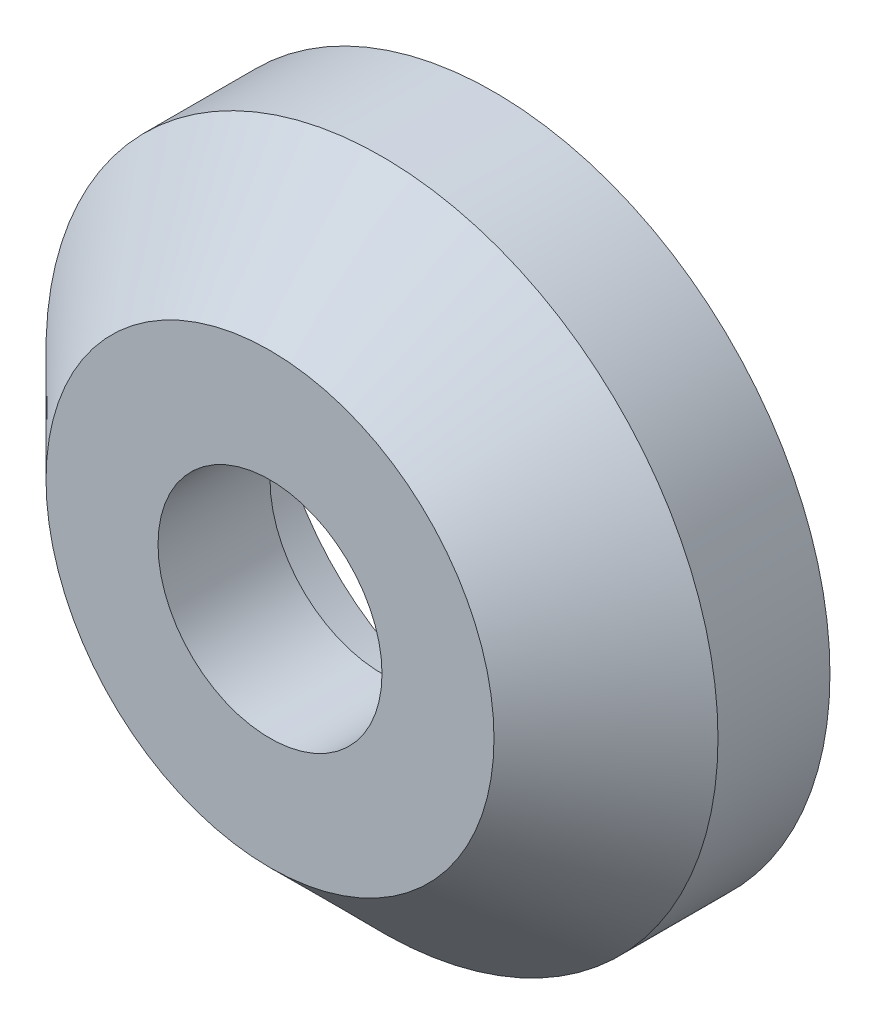
ISO-10303-21;
HEADER;
FILE_DESCRIPTION(('STEP AP214'),'2;1');
FILE_NAME('part.step','',(''),(''),'','','');
FILE_SCHEMA(('AUTOMOTIVE_DESIGN { 1 0 10303 214 1 1 1 1 }'));
ENDSEC;
DATA;
#1=APPLICATION_CONTEXT('core data for automotive mechanical design processes');
#2=APPLICATION_PROTOCOL_DEFINITION('international standard','automotive_design',2000,#1);
#3=PRODUCT_CONTEXT('',#1,'mechanical');
#4=PRODUCT('Part','Part','',(#3));
#5=PRODUCT_RELATED_PRODUCT_CATEGORY('part','',(#4));
#6=PRODUCT_DEFINITION_FORMATION('','',#4);
#7=PRODUCT_DEFINITION_CONTEXT('part definition',#1,'design');
#8=PRODUCT_DEFINITION('design','',#6,#7);
#9=PRODUCT_DEFINITION_SHAPE('','',#8);
#10=(LENGTH_UNIT() NAMED_UNIT(*) SI_UNIT(.MILLI.,.METRE.));
#11=(NAMED_UNIT(*) PLANE_ANGLE_UNIT() SI_UNIT($,.RADIAN.));
#12=(NAMED_UNIT(*) SI_UNIT($,.STERADIAN.) SOLID_ANGLE_UNIT());
#13=UNCERTAINTY_MEASURE_WITH_UNIT(LENGTH_MEASURE(1.E-05),#10,'distance_accuracy_value','');
#14=(GEOMETRIC_REPRESENTATION_CONTEXT(3) GLOBAL_UNCERTAINTY_ASSIGNED_CONTEXT((#13)) GLOBAL_UNIT_ASSIGNED_CONTEXT((#10,
#11,#12)) REPRESENTATION_CONTEXT('',''));
#15=CARTESIAN_POINT('',(0.,0.,0.));
#16=DIRECTION('',(0.,0.,1.));
#17=DIRECTION('',(1.,0.,0.));
#18=AXIS2_PLACEMENT_3D('',#15,#16,#17);
#19=CARTESIAN_POINT('',(0.,0.,5.));
#20=DIRECTION('',(0.,0.,-1.));
#21=DIRECTION('',(-1.,0.,0.));
#22=AXIS2_PLACEMENT_3D('',#19,#20,#21);
#23=CYLINDRICAL_SURFACE('',#22,2.5);
#24=CARTESIAN_POINT('',(0.,0.,5.));
#25=DIRECTION('',(0.,0.,1.));
#26=DIRECTION('',(1.,0.,0.));
#27=AXIS2_PLACEMENT_3D('',#24,#25,#26);
#28=CIRCLE('',#27,2.5);
#29=CARTESIAN_POINT('',(2.5,0.,5.));
#30=VERTEX_POINT('',#29);
#31=EDGE_CURVE('E52',#30,#30,#28,.T.);
#32=ORIENTED_EDGE('',*,*,#31,.T.);
#33=EDGE_LOOP('',(#32));
#34=FACE_BOUND('',#33,.T.);
#35=CARTESIAN_POINT('',(0.,0.,2.5));
#36=DIRECTION('',(0.,0.,-1.));
#37=DIRECTION('',(-1.,0.,0.));
#38=AXIS2_PLACEMENT_3D('',#35,#36,#37);
#39=CIRCLE('',#38,2.5);
#40=CARTESIAN_POINT('',(-2.5,0.,2.5));
#41=VERTEX_POINT('',#40);
#42=EDGE_CURVE('E39',#41,#41,#39,.T.);
#43=ORIENTED_EDGE('',*,*,#42,.T.);
#44=EDGE_LOOP('',(#43));
#45=FACE_BOUND('',#44,.T.);
#46=ADVANCED_FACE('F34',(#34,#45),#23,.F.);
#47=CARTESIAN_POINT('',(0.,0.,5.));
#48=DIRECTION('',(0.,0.,1.));
#49=DIRECTION('',(1.,0.,0.));
#50=AXIS2_PLACEMENT_3D('',#47,#48,#49);
#51=PLANE('',#50);
#52=CARTESIAN_POINT('',(0.,0.,5.));
#53=DIRECTION('',(0.,0.,1.));
#54=DIRECTION('',(1.,0.,0.));
#55=AXIS2_PLACEMENT_3D('',#52,#53,#54);
#56=CIRCLE('',#55,5.);
#57=CARTESIAN_POINT('',(5.,0.,5.));
#58=VERTEX_POINT('',#57);
#59=EDGE_CURVE('E43',#58,#58,#56,.T.);
#60=ORIENTED_EDGE('',*,*,#59,.T.);
#61=EDGE_LOOP('',(#60));
#62=FACE_BOUND('',#61,.T.);
#63=ORIENTED_EDGE('',*,*,#31,.F.);
#64=EDGE_LOOP('',(#63));
#65=FACE_BOUND('',#64,.T.);
#66=ADVANCED_FACE('F76',(#62,#65),#51,.T.);
#67=CARTESIAN_POINT('',(0.,0.,0.));
#68=DIRECTION('',(0.,0.,1.));
#69=DIRECTION('',(1.,0.,0.));
#70=AXIS2_PLACEMENT_3D('',#67,#68,#69);
#71=PLANE('',#70);
#72=CARTESIAN_POINT('',(0.,0.,0.));
#73=DIRECTION('',(0.,0.,-1.));
#74=DIRECTION('',(-1.,0.,0.));
#75=AXIS2_PLACEMENT_3D('',#72,#73,#74);
#76=CIRCLE('',#75,5.);
#77=CARTESIAN_POINT('',(-5.,0.,0.));
#78=VERTEX_POINT('',#77);
#79=EDGE_CURVE('E55',#78,#78,#76,.T.);
#80=ORIENTED_EDGE('',*,*,#79,.F.);
#81=EDGE_LOOP('',(#80));
#82=FACE_BOUND('',#81,.T.);
#83=CARTESIAN_POINT('',(0.,0.,0.));
#84=DIRECTION('',(0.,0.,1.));
#85=DIRECTION('',(1.,0.,0.));
#86=AXIS2_PLACEMENT_3D('',#83,#84,#85);
#87=CIRCLE('',#86,7.5);
#88=CARTESIAN_POINT('',(7.5,0.,0.));
#89=VERTEX_POINT('',#88);
#90=EDGE_CURVE('E47',#89,#89,#87,.T.);
#91=ORIENTED_EDGE('',*,*,#90,.F.);
#92=EDGE_LOOP('',(#91));
#93=FACE_BOUND('',#92,.T.);
#94=ADVANCED_FACE('F82',(#82,#93),#71,.F.);
#95=CARTESIAN_POINT('',(0.,0.,5.));
#96=DIRECTION('',(0.,0.,-1.));
#97=DIRECTION('',(-1.,0.,0.));
#98=AXIS2_PLACEMENT_3D('',#95,#96,#97);
#99=CYLINDRICAL_SURFACE('',#98,7.5);
#100=CARTESIAN_POINT('',(0.,0.,2.5));
#101=DIRECTION('',(0.,0.,1.));
#102=DIRECTION('',(1.,0.,0.));
#103=AXIS2_PLACEMENT_3D('',#100,#101,#102);
#104=CIRCLE('',#103,7.5);
#105=CARTESIAN_POINT('',(7.5,0.,2.5));
#106=VERTEX_POINT('',#105);
#107=EDGE_CURVE('E10',#106,#106,#104,.F.);
#108=ORIENTED_EDGE('',*,*,#107,.T.);
#109=EDGE_LOOP('',(#108));
#110=FACE_BOUND('',#109,.T.);
#111=ORIENTED_EDGE('',*,*,#90,.T.);
#112=EDGE_LOOP('',(#111));
#113=FACE_BOUND('',#112,.T.);
#114=ADVANCED_FACE('F87',(#110,#113),#99,.T.);
#115=CARTESIAN_POINT('',(0.,0.,5.));
#116=DIRECTION('',(0.,0.,-1.));
#117=DIRECTION('',(-1.,0.,0.));
#118=AXIS2_PLACEMENT_3D('',#115,#116,#117);
#119=CONICAL_SURFACE('',#118,5.,0.785398163397447);
#120=ORIENTED_EDGE('',*,*,#107,.F.);
#121=EDGE_LOOP('',(#120));
#122=FACE_BOUND('',#121,.T.);
#123=ORIENTED_EDGE('',*,*,#59,.F.);
#124=EDGE_LOOP('',(#123));
#125=FACE_BOUND('',#124,.T.);
#126=ADVANCED_FACE('F37',(#122,#125),#119,.T.);
#127=CARTESIAN_POINT('',(0.,0.,2.5));
#128=DIRECTION('',(0.,0.,-1.));
#129=DIRECTION('',(-1.,0.,0.));
#130=AXIS2_PLACEMENT_3D('',#127,#128,#129);
#131=CYLINDRICAL_SURFACE('',#130,5.);
#132=CARTESIAN_POINT('',(0.,0.,2.5));
#133=DIRECTION('',(0.,0.,-1.));
#134=DIRECTION('',(-1.,0.,0.));
#135=AXIS2_PLACEMENT_3D('',#132,#133,#134);
#136=CIRCLE('',#135,5.);
#137=CARTESIAN_POINT('',(-5.,0.,2.5));
#138=VERTEX_POINT('',#137);
#139=EDGE_CURVE('E58',#138,#138,#136,.T.);
#140=ORIENTED_EDGE('',*,*,#139,.F.);
#141=EDGE_LOOP('',(#140));
#142=FACE_BOUND('',#141,.T.);
#143=ORIENTED_EDGE('',*,*,#79,.T.);
#144=EDGE_LOOP('',(#143));
#145=FACE_BOUND('',#144,.T.);
#146=ADVANCED_FACE('F68',(#142,#145),#131,.F.);
#147=CARTESIAN_POINT('',(0.,0.,2.5));
#148=DIRECTION('',(0.,0.,-1.));
#149=DIRECTION('',(-1.,0.,0.));
#150=AXIS2_PLACEMENT_3D('',#147,#148,#149);
#151=PLANE('',#150);
#152=ORIENTED_EDGE('',*,*,#42,.F.);
#153=EDGE_LOOP('',(#152));
#154=FACE_BOUND('',#153,.T.);
#155=ORIENTED_EDGE('',*,*,#139,.T.);
#156=EDGE_LOOP('',(#155));
#157=FACE_BOUND('',#156,.T.);
#158=ADVANCED_FACE('F66',(#154,#157),#151,.T.);
#159=CLOSED_SHELL('',(#46,#66,#94,#114,#126,#146,#158));
#160=MANIFOLD_SOLID_BREP('B2',#159);
#161=ADVANCED_BREP_SHAPE_REPRESENTATION('',(#18,#160),#14);
#162=SHAPE_DEFINITION_REPRESENTATION(#9,#161);
ENDSEC;
END-ISO-10303-21;
